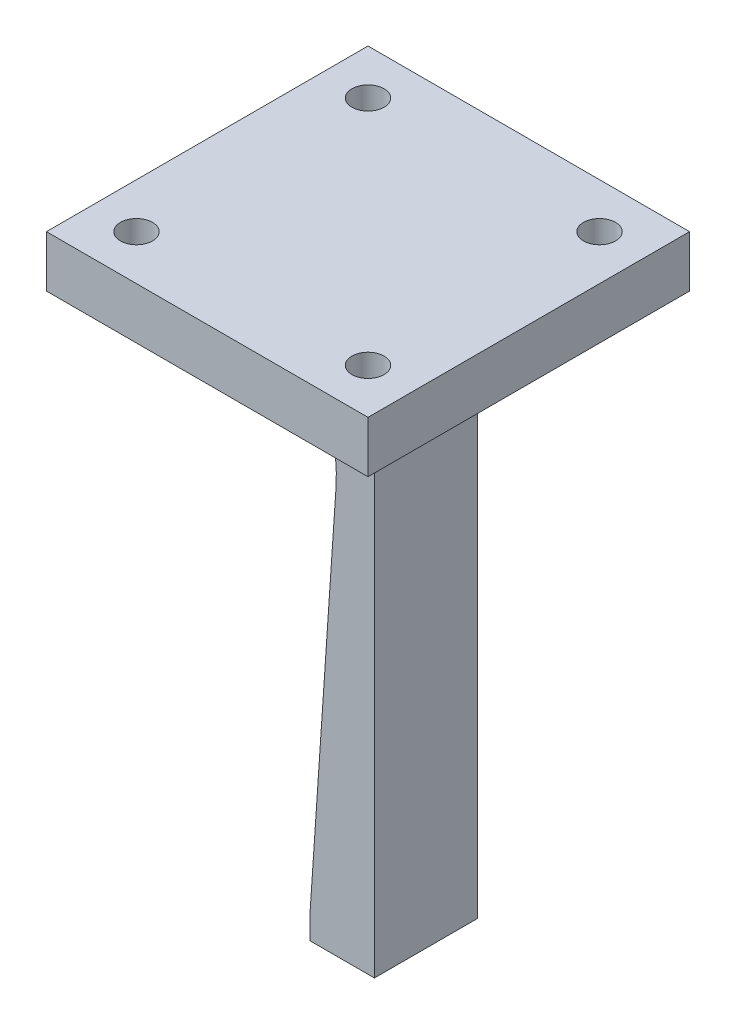
ISO-10303-21;
HEADER;
FILE_DESCRIPTION(('STEP AP214'),'2;1');
FILE_NAME('part.step','',(''),(''),'','','');
FILE_SCHEMA(('AUTOMOTIVE_DESIGN { 1 0 10303 214 1 1 1 1 }'));
ENDSEC;
DATA;
#1=APPLICATION_CONTEXT('core data for automotive mechanical design processes');
#2=APPLICATION_PROTOCOL_DEFINITION('international standard','automotive_design',2000,#1);
#3=PRODUCT_CONTEXT('',#1,'mechanical');
#4=PRODUCT('Part','Part','',(#3));
#5=PRODUCT_RELATED_PRODUCT_CATEGORY('part','',(#4));
#6=PRODUCT_DEFINITION_FORMATION('','',#4);
#7=PRODUCT_DEFINITION_CONTEXT('part definition',#1,'design');
#8=PRODUCT_DEFINITION('design','',#6,#7);
#9=PRODUCT_DEFINITION_SHAPE('','',#8);
#10=(LENGTH_UNIT() NAMED_UNIT(*) SI_UNIT(.MILLI.,.METRE.));
#11=(NAMED_UNIT(*) PLANE_ANGLE_UNIT() SI_UNIT($,.RADIAN.));
#12=(NAMED_UNIT(*) SI_UNIT($,.STERADIAN.) SOLID_ANGLE_UNIT());
#13=UNCERTAINTY_MEASURE_WITH_UNIT(LENGTH_MEASURE(1.E-05),#10,'distance_accuracy_value','');
#14=(GEOMETRIC_REPRESENTATION_CONTEXT(3) GLOBAL_UNCERTAINTY_ASSIGNED_CONTEXT((#13)) GLOBAL_UNIT_ASSIGNED_CONTEXT((#10,
#11,#12)) REPRESENTATION_CONTEXT('',''));
#15=CARTESIAN_POINT('',(0.,0.,0.));
#16=DIRECTION('',(0.,0.,1.));
#17=DIRECTION('',(1.,0.,0.));
#18=AXIS2_PLACEMENT_3D('',#15,#16,#17);
#19=CARTESIAN_POINT('',(0.,4.,0.));
#20=DIRECTION('',(1.,0.,0.));
#21=DIRECTION('',(0.,0.,-1.));
#22=AXIS2_PLACEMENT_3D('',#19,#20,#21);
#23=PLANE('',#22);
#24=DIRECTION('',(0.,-1.,0.));
#25=VECTOR('',#24,1.);
#26=CARTESIAN_POINT('',(0.,4.,-13.));
#27=LINE('',#26,#25);
#28=CARTESIAN_POINT('',(0.,2.,-13.));
#29=VERTEX_POINT('',#28);
#30=CARTESIAN_POINT('',(0.,0.,-13.));
#31=VERTEX_POINT('',#30);
#32=EDGE_CURVE('E165',#29,#31,#27,.T.);
#33=ORIENTED_EDGE('',*,*,#32,.F.);
#34=DIRECTION('',(0.,0.,1.));
#35=VECTOR('',#34,1.);
#36=CARTESIAN_POINT('',(0.,2.,-13.));
#37=LINE('',#36,#35);
#38=CARTESIAN_POINT('',(0.,2.,-10.5));
#39=VERTEX_POINT('',#38);
#40=EDGE_CURVE('E163',#29,#39,#37,.T.);
#41=ORIENTED_EDGE('',*,*,#40,.T.);
#42=DIRECTION('',(0.,0.,1.));
#43=VECTOR('',#42,1.);
#44=CARTESIAN_POINT('',(0.,2.,-10.5));
#45=LINE('',#44,#43);
#46=CARTESIAN_POINT('',(0.,2.,-2.5));
#47=VERTEX_POINT('',#46);
#48=EDGE_CURVE('E150',#39,#47,#45,.T.);
#49=ORIENTED_EDGE('',*,*,#48,.T.);
#50=CARTESIAN_POINT('',(0.,2.,0.));
#51=VERTEX_POINT('',#50);
#52=EDGE_CURVE('E167',#47,#51,#37,.T.);
#53=ORIENTED_EDGE('',*,*,#52,.T.);
#54=DIRECTION('',(0.,-1.,0.));
#55=VECTOR('',#54,1.);
#56=CARTESIAN_POINT('',(0.,4.,0.));
#57=LINE('',#56,#55);
#58=CARTESIAN_POINT('',(0.,0.,0.));
#59=VERTEX_POINT('',#58);
#60=EDGE_CURVE('E229',#51,#59,#57,.T.);
#61=ORIENTED_EDGE('',*,*,#60,.T.);
#62=DIRECTION('',(0.,0.,1.));
#63=VECTOR('',#62,1.);
#64=CARTESIAN_POINT('',(0.,0.,0.));
#65=LINE('',#64,#63);
#66=EDGE_CURVE('E206',#31,#59,#65,.T.);
#67=ORIENTED_EDGE('',*,*,#66,.F.);
#68=EDGE_LOOP('',(#33,#41,#49,#53,#61,#67));
#69=FACE_BOUND('',#68,.T.);
#70=ADVANCED_FACE('F36',(#69),#23,.T.);
#71=CARTESIAN_POINT('',(0.,4.,0.));
#72=DIRECTION('',(0.,0.,-1.));
#73=DIRECTION('',(-1.,0.,0.));
#74=AXIS2_PLACEMENT_3D('',#71,#72,#73);
#75=PLANE('',#74);
#76=ORIENTED_EDGE('',*,*,#60,.F.);
#77=DIRECTION('',(1.,0.,0.));
#78=VECTOR('',#77,1.);
#79=CARTESIAN_POINT('',(0.,2.,0.));
#80=LINE('',#79,#78);
#81=CARTESIAN_POINT('',(13.,2.,0.));
#82=VERTEX_POINT('',#81);
#83=EDGE_CURVE('E176',#51,#82,#80,.T.);
#84=ORIENTED_EDGE('',*,*,#83,.T.);
#85=DIRECTION('',(0.,-1.,0.));
#86=VECTOR('',#85,1.);
#87=CARTESIAN_POINT('',(13.,4.,0.));
#88=LINE('',#87,#86);
#89=CARTESIAN_POINT('',(13.,0.,0.));
#90=VERTEX_POINT('',#89);
#91=EDGE_CURVE('E227',#82,#90,#88,.T.);
#92=ORIENTED_EDGE('',*,*,#91,.T.);
#93=DIRECTION('',(1.,0.,0.));
#94=VECTOR('',#93,1.);
#95=CARTESIAN_POINT('',(0.,0.,0.));
#96=LINE('',#95,#94);
#97=EDGE_CURVE('E215',#59,#90,#96,.T.);
#98=ORIENTED_EDGE('',*,*,#97,.F.);
#99=EDGE_LOOP('',(#76,#84,#92,#98));
#100=FACE_BOUND('',#99,.T.);
#101=ADVANCED_FACE('F318',(#100),#75,.T.);
#102=CARTESIAN_POINT('',(13.,4.,0.));
#103=DIRECTION('',(-1.,0.,0.));
#104=DIRECTION('',(0.,0.,1.));
#105=AXIS2_PLACEMENT_3D('',#102,#103,#104);
#106=PLANE('',#105);
#107=ORIENTED_EDGE('',*,*,#91,.F.);
#108=DIRECTION('',(0.,0.,-1.));
#109=VECTOR('',#108,1.);
#110=CARTESIAN_POINT('',(13.,2.,-2.5));
#111=LINE('',#110,#109);
#112=CARTESIAN_POINT('',(13.,2.,-13.));
#113=VERTEX_POINT('',#112);
#114=EDGE_CURVE('E61',#82,#113,#111,.T.);
#115=ORIENTED_EDGE('',*,*,#114,.T.);
#116=DIRECTION('',(0.,-1.,0.));
#117=VECTOR('',#116,1.);
#118=CARTESIAN_POINT('',(13.,4.,-13.));
#119=LINE('',#118,#117);
#120=CARTESIAN_POINT('',(13.,0.,-13.));
#121=VERTEX_POINT('',#120);
#122=EDGE_CURVE('E225',#113,#121,#119,.T.);
#123=ORIENTED_EDGE('',*,*,#122,.T.);
#124=DIRECTION('',(0.,0.,-1.));
#125=VECTOR('',#124,1.);
#126=CARTESIAN_POINT('',(13.,0.,0.));
#127=LINE('',#126,#125);
#128=EDGE_CURVE('E218',#90,#121,#127,.T.);
#129=ORIENTED_EDGE('',*,*,#128,.F.);
#130=EDGE_LOOP('',(#107,#115,#123,#129));
#131=FACE_BOUND('',#130,.T.);
#132=ADVANCED_FACE('F320',(#131),#106,.T.);
#133=CARTESIAN_POINT('',(0.,4.,-13.));
#134=DIRECTION('',(0.,0.,1.));
#135=DIRECTION('',(1.,0.,0.));
#136=AXIS2_PLACEMENT_3D('',#133,#134,#135);
#137=PLANE('',#136);
#138=ORIENTED_EDGE('',*,*,#122,.F.);
#139=DIRECTION('',(-1.,0.,0.));
#140=VECTOR('',#139,1.);
#141=CARTESIAN_POINT('',(0.,2.,-13.));
#142=LINE('',#141,#140);
#143=EDGE_CURVE('E53',#113,#29,#142,.T.);
#144=ORIENTED_EDGE('',*,*,#143,.T.);
#145=ORIENTED_EDGE('',*,*,#32,.T.);
#146=DIRECTION('',(-1.,0.,0.));
#147=VECTOR('',#146,1.);
#148=CARTESIAN_POINT('',(0.,0.,-13.));
#149=LINE('',#148,#147);
#150=EDGE_CURVE('E221',#121,#31,#149,.T.);
#151=ORIENTED_EDGE('',*,*,#150,.F.);
#152=EDGE_LOOP('',(#138,#144,#145,#151));
#153=FACE_BOUND('',#152,.T.);
#154=ADVANCED_FACE('F321',(#153),#137,.T.);
#155=CARTESIAN_POINT('',(0.,0.,-2.5));
#156=DIRECTION('',(0.,0.,1.));
#157=DIRECTION('',(1.,0.,0.));
#158=AXIS2_PLACEMENT_3D('',#155,#156,#157);
#159=PLANE('',#158);
#160=DIRECTION('',(0.,-1.,0.));
#161=VECTOR('',#160,1.);
#162=CARTESIAN_POINT('',(11.,-42.,-2.5));
#163=LINE('',#162,#161);
#164=CARTESIAN_POINT('',(11.,2.,-2.5));
#165=VERTEX_POINT('',#164);
#166=CARTESIAN_POINT('',(11.,-42.,-2.5));
#167=VERTEX_POINT('',#166);
#168=EDGE_CURVE('E194',#165,#167,#163,.T.);
#169=ORIENTED_EDGE('',*,*,#168,.F.);
#170=DIRECTION('',(-1.,0.,0.));
#171=VECTOR('',#170,1.);
#172=CARTESIAN_POINT('',(0.,2.,-2.5));
#173=LINE('',#172,#171);
#174=EDGE_CURVE('E173',#165,#47,#173,.T.);
#175=ORIENTED_EDGE('',*,*,#174,.T.);
#176=CARTESIAN_POINT('',(-4.4615218751535,-9.67667857558505,-2.5));
#177=DIRECTION('',(0.,0.,-1.));
#178=DIRECTION('',(1.,0.,0.));
#179=AXIS2_PLACEMENT_3D('',#176,#177,#178);
#180=CIRCLE('',#179,12.5);
#181=CARTESIAN_POINT('',(8.00952428336575,-10.5269771773023,-2.5));
#182=VERTEX_POINT('',#181);
#183=EDGE_CURVE('E151',#47,#182,#180,.T.);
#184=ORIENTED_EDGE('',*,*,#183,.T.);
#185=DIRECTION('',(0.0680238881373777,0.99768369268154,0.));
#186=VECTOR('',#185,1.);
#187=CARTESIAN_POINT('',(6.,-40.,-2.5));
#188=LINE('',#187,#186);
#189=CARTESIAN_POINT('',(6.,-40.,-2.5));
#190=VERTEX_POINT('',#189);
#191=EDGE_CURVE('E185',#190,#182,#188,.T.);
#192=ORIENTED_EDGE('',*,*,#191,.F.);
#193=DIRECTION('',(0.,1.,0.));
#194=VECTOR('',#193,1.);
#195=CARTESIAN_POINT('',(6.,-40.,-2.5));
#196=LINE('',#195,#194);
#197=CARTESIAN_POINT('',(6.,-42.,-2.5));
#198=VERTEX_POINT('',#197);
#199=EDGE_CURVE('E200',#198,#190,#196,.T.);
#200=ORIENTED_EDGE('',*,*,#199,.F.);
#201=DIRECTION('',(-1.,0.,0.));
#202=VECTOR('',#201,1.);
#203=CARTESIAN_POINT('',(6.,-42.,-2.5));
#204=LINE('',#203,#202);
#205=EDGE_CURVE('E197',#167,#198,#204,.T.);
#206=ORIENTED_EDGE('',*,*,#205,.F.);
#207=EDGE_LOOP('',(#169,#175,#184,#192,#200,#206));
#208=FACE_BOUND('',#207,.T.);
#209=ADVANCED_FACE('F323',(#208),#159,.T.);
#210=CARTESIAN_POINT('',(0.,0.,-10.5));
#211=DIRECTION('',(0.,0.,1.));
#212=DIRECTION('',(1.,0.,0.));
#213=AXIS2_PLACEMENT_3D('',#210,#211,#212);
#214=PLANE('',#213);
#215=DIRECTION('',(-1.,0.,0.));
#216=VECTOR('',#215,1.);
#217=CARTESIAN_POINT('',(0.,2.,-10.5));
#218=LINE('',#217,#216);
#219=CARTESIAN_POINT('',(11.,2.,-10.5));
#220=VERTEX_POINT('',#219);
#221=EDGE_CURVE('E144',#220,#39,#218,.T.);
#222=ORIENTED_EDGE('',*,*,#221,.F.);
#223=DIRECTION('',(0.,-1.,0.));
#224=VECTOR('',#223,1.);
#225=CARTESIAN_POINT('',(11.,-42.,-10.5));
#226=LINE('',#225,#224);
#227=CARTESIAN_POINT('',(11.,-42.,-10.5));
#228=VERTEX_POINT('',#227);
#229=EDGE_CURVE('E187',#220,#228,#226,.T.);
#230=ORIENTED_EDGE('',*,*,#229,.T.);
#231=DIRECTION('',(-1.,0.,0.));
#232=VECTOR('',#231,1.);
#233=CARTESIAN_POINT('',(6.,-42.,-10.5));
#234=LINE('',#233,#232);
#235=CARTESIAN_POINT('',(6.,-42.,-10.5));
#236=VERTEX_POINT('',#235);
#237=EDGE_CURVE('E189',#228,#236,#234,.T.);
#238=ORIENTED_EDGE('',*,*,#237,.T.);
#239=DIRECTION('',(0.,1.,0.));
#240=VECTOR('',#239,1.);
#241=CARTESIAN_POINT('',(6.,-40.,-10.5));
#242=LINE('',#241,#240);
#243=CARTESIAN_POINT('',(6.,-40.,-10.5));
#244=VERTEX_POINT('',#243);
#245=EDGE_CURVE('E192',#236,#244,#242,.T.);
#246=ORIENTED_EDGE('',*,*,#245,.T.);
#247=DIRECTION('',(0.0680238881373777,0.99768369268154,0.));
#248=VECTOR('',#247,1.);
#249=CARTESIAN_POINT('',(6.,-40.,-10.5));
#250=LINE('',#249,#248);
#251=CARTESIAN_POINT('',(8.00952428336575,-10.5269771773023,-10.5));
#252=VERTEX_POINT('',#251);
#253=EDGE_CURVE('E147',#244,#252,#250,.T.);
#254=ORIENTED_EDGE('',*,*,#253,.T.);
#255=CARTESIAN_POINT('',(-4.4615218751535,-9.67667857558505,-10.5));
#256=DIRECTION('',(0.,0.,-1.));
#257=DIRECTION('',(1.,0.,0.));
#258=AXIS2_PLACEMENT_3D('',#255,#256,#257);
#259=CIRCLE('',#258,12.5);
#260=EDGE_CURVE('E139',#39,#252,#259,.T.);
#261=ORIENTED_EDGE('',*,*,#260,.F.);
#262=EDGE_LOOP('',(#222,#230,#238,#246,#254,#261));
#263=FACE_BOUND('',#262,.T.);
#264=ADVANCED_FACE('F141',(#263),#214,.F.);
#265=CARTESIAN_POINT('',(6.00000000000001,-40.,41.6021541423999));
#266=DIRECTION('',(-0.99768369268154,0.0680238881373777,0.));
#267=DIRECTION('',(-0.0680238881373777,-0.99768369268154,0.));
#268=AXIS2_PLACEMENT_3D('',#265,#266,#267);
#269=PLANE('',#268);
#270=ORIENTED_EDGE('',*,*,#191,.T.);
#271=DIRECTION('',(0.,0.,1.));
#272=VECTOR('',#271,1.);
#273=CARTESIAN_POINT('',(8.00952428336576,-10.5269771773023,-10.5));
#274=LINE('',#273,#272);
#275=EDGE_CURVE('E160',#252,#182,#274,.T.);
#276=ORIENTED_EDGE('',*,*,#275,.F.);
#277=ORIENTED_EDGE('',*,*,#253,.F.);
#278=DIRECTION('',(0.,0.,-1.));
#279=VECTOR('',#278,1.);
#280=CARTESIAN_POINT('',(6.,-40.,-2.5));
#281=LINE('',#280,#279);
#282=EDGE_CURVE('E203',#190,#244,#281,.T.);
#283=ORIENTED_EDGE('',*,*,#282,.F.);
#284=EDGE_LOOP('',(#270,#276,#277,#283));
#285=FACE_BOUND('',#284,.T.);
#286=ADVANCED_FACE('F289',(#285),#269,.T.);
#287=CARTESIAN_POINT('',(0.,4.,0.));
#288=DIRECTION('',(0.,1.,0.));
#289=DIRECTION('',(0.,0.,1.));
#290=AXIS2_PLACEMENT_3D('',#287,#288,#289);
#291=PLANE('',#290);
#292=CARTESIAN_POINT('',(15.5,4.,2.49999999999999));
#293=DIRECTION('',(0.,1.,0.));
#294=DIRECTION('',(0.,0.,1.));
#295=AXIS2_PLACEMENT_3D('',#292,#293,#294);
#296=CIRCLE('',#295,1.25);
#297=CARTESIAN_POINT('',(15.5,4.,3.74999999999999));
#298=VERTEX_POINT('',#297);
#299=EDGE_CURVE('E276',#298,#298,#296,.T.);
#300=ORIENTED_EDGE('',*,*,#299,.F.);
#301=EDGE_LOOP('',(#300));
#302=FACE_BOUND('',#301,.T.);
#303=CARTESIAN_POINT('',(-2.5,4.,2.5));
#304=DIRECTION('',(0.,1.,0.));
#305=DIRECTION('',(0.,0.,1.));
#306=AXIS2_PLACEMENT_3D('',#303,#304,#305);
#307=CIRCLE('',#306,1.25);
#308=CARTESIAN_POINT('',(-2.5,4.,3.75));
#309=VERTEX_POINT('',#308);
#310=EDGE_CURVE('E266',#309,#309,#307,.T.);
#311=ORIENTED_EDGE('',*,*,#310,.F.);
#312=EDGE_LOOP('',(#311));
#313=FACE_BOUND('',#312,.T.);
#314=CARTESIAN_POINT('',(15.5,4.,-15.5));
#315=DIRECTION('',(0.,1.,0.));
#316=DIRECTION('',(0.,0.,1.));
#317=AXIS2_PLACEMENT_3D('',#314,#315,#316);
#318=CIRCLE('',#317,1.25);
#319=CARTESIAN_POINT('',(15.5,4.,-14.25));
#320=VERTEX_POINT('',#319);
#321=EDGE_CURVE('E263',#320,#320,#318,.T.);
#322=ORIENTED_EDGE('',*,*,#321,.F.);
#323=EDGE_LOOP('',(#322));
#324=FACE_BOUND('',#323,.T.);
#325=CARTESIAN_POINT('',(-2.5,4.,-15.5));
#326=DIRECTION('',(0.,1.,0.));
#327=DIRECTION('',(0.,0.,1.));
#328=AXIS2_PLACEMENT_3D('',#325,#326,#327);
#329=CIRCLE('',#328,1.25);
#330=CARTESIAN_POINT('',(-2.5,4.,-14.25));
#331=VERTEX_POINT('',#330);
#332=EDGE_CURVE('E260',#331,#331,#329,.T.);
#333=ORIENTED_EDGE('',*,*,#332,.F.);
#334=EDGE_LOOP('',(#333));
#335=FACE_BOUND('',#334,.T.);
#336=DIRECTION('',(0.,0.,1.));
#337=VECTOR('',#336,1.);
#338=CARTESIAN_POINT('',(-6.00000000000001,4.,-19.));
#339=LINE('',#338,#337);
#340=CARTESIAN_POINT('',(-6.00000000000001,4.,-19.));
#341=VERTEX_POINT('',#340);
#342=CARTESIAN_POINT('',(-6.,4.,6.00000000000001));
#343=VERTEX_POINT('',#342);
#344=EDGE_CURVE('E232',#341,#343,#339,.T.);
#345=ORIENTED_EDGE('',*,*,#344,.T.);
#346=DIRECTION('',(1.,0.,0.));
#347=VECTOR('',#346,1.);
#348=CARTESIAN_POINT('',(-6.,4.,6.00000000000001));
#349=LINE('',#348,#347);
#350=CARTESIAN_POINT('',(19.,4.,6.));
#351=VERTEX_POINT('',#350);
#352=EDGE_CURVE('E235',#343,#351,#349,.T.);
#353=ORIENTED_EDGE('',*,*,#352,.T.);
#354=DIRECTION('',(0.,0.,-1.));
#355=VECTOR('',#354,1.);
#356=CARTESIAN_POINT('',(19.,4.,-19.));
#357=LINE('',#356,#355);
#358=CARTESIAN_POINT('',(19.,4.,-19.));
#359=VERTEX_POINT('',#358);
#360=EDGE_CURVE('E238',#351,#359,#357,.T.);
#361=ORIENTED_EDGE('',*,*,#360,.T.);
#362=DIRECTION('',(-1.,0.,0.));
#363=VECTOR('',#362,1.);
#364=CARTESIAN_POINT('',(-6.00000000000001,4.,-19.));
#365=LINE('',#364,#363);
#366=EDGE_CURVE('E240',#359,#341,#365,.T.);
#367=ORIENTED_EDGE('',*,*,#366,.T.);
#368=EDGE_LOOP('',(#345,#353,#361,#367));
#369=FACE_BOUND('',#368,.T.);
#370=ADVANCED_FACE('F285',(#302,#313,#324,#335,#369),#291,.T.);
#371=CARTESIAN_POINT('',(0.,0.,0.));
#372=DIRECTION('',(0.,1.,0.));
#373=DIRECTION('',(0.,0.,1.));
#374=AXIS2_PLACEMENT_3D('',#371,#372,#373);
#375=PLANE('',#374);
#376=CARTESIAN_POINT('',(15.5,0.,2.49999999999999));
#377=DIRECTION('',(0.,1.,0.));
#378=DIRECTION('',(0.,0.,1.));
#379=AXIS2_PLACEMENT_3D('',#376,#377,#378);
#380=CIRCLE('',#379,1.25);
#381=CARTESIAN_POINT('',(15.5,0.,3.74999999999999));
#382=VERTEX_POINT('',#381);
#383=EDGE_CURVE('E40',#382,#382,#380,.T.);
#384=ORIENTED_EDGE('',*,*,#383,.T.);
#385=EDGE_LOOP('',(#384));
#386=FACE_BOUND('',#385,.T.);
#387=CARTESIAN_POINT('',(-2.5,0.,2.5));
#388=DIRECTION('',(0.,1.,0.));
#389=DIRECTION('',(0.,0.,1.));
#390=AXIS2_PLACEMENT_3D('',#387,#388,#389);
#391=CIRCLE('',#390,1.25);
#392=CARTESIAN_POINT('',(-2.5,0.,3.75));
#393=VERTEX_POINT('',#392);
#394=EDGE_CURVE('E264',#393,#393,#391,.T.);
#395=ORIENTED_EDGE('',*,*,#394,.T.);
#396=EDGE_LOOP('',(#395));
#397=FACE_BOUND('',#396,.T.);
#398=CARTESIAN_POINT('',(15.5,0.,-15.5));
#399=DIRECTION('',(0.,1.,0.));
#400=DIRECTION('',(0.,0.,1.));
#401=AXIS2_PLACEMENT_3D('',#398,#399,#400);
#402=CIRCLE('',#401,1.25);
#403=CARTESIAN_POINT('',(15.5,0.,-14.25));
#404=VERTEX_POINT('',#403);
#405=EDGE_CURVE('E261',#404,#404,#402,.T.);
#406=ORIENTED_EDGE('',*,*,#405,.T.);
#407=EDGE_LOOP('',(#406));
#408=FACE_BOUND('',#407,.T.);
#409=CARTESIAN_POINT('',(-2.5,0.,-15.5));
#410=DIRECTION('',(0.,1.,0.));
#411=DIRECTION('',(0.,0.,1.));
#412=AXIS2_PLACEMENT_3D('',#409,#410,#411);
#413=CIRCLE('',#412,1.25);
#414=CARTESIAN_POINT('',(-2.5,0.,-14.25));
#415=VERTEX_POINT('',#414);
#416=EDGE_CURVE('E257',#415,#415,#413,.T.);
#417=ORIENTED_EDGE('',*,*,#416,.T.);
#418=EDGE_LOOP('',(#417));
#419=FACE_BOUND('',#418,.T.);
#420=DIRECTION('',(0.,0.,1.));
#421=VECTOR('',#420,1.);
#422=CARTESIAN_POINT('',(-6.00000000000001,0.,-19.));
#423=LINE('',#422,#421);
#424=CARTESIAN_POINT('',(-6.00000000000001,0.,-19.));
#425=VERTEX_POINT('',#424);
#426=CARTESIAN_POINT('',(-6.,0.,6.00000000000001));
#427=VERTEX_POINT('',#426);
#428=EDGE_CURVE('E231',#425,#427,#423,.T.);
#429=ORIENTED_EDGE('',*,*,#428,.F.);
#430=DIRECTION('',(-1.,0.,0.));
#431=VECTOR('',#430,1.);
#432=CARTESIAN_POINT('',(-6.00000000000001,0.,-19.));
#433=LINE('',#432,#431);
#434=CARTESIAN_POINT('',(19.,0.,-19.));
#435=VERTEX_POINT('',#434);
#436=EDGE_CURVE('E236',#435,#425,#433,.T.);
#437=ORIENTED_EDGE('',*,*,#436,.F.);
#438=DIRECTION('',(0.,0.,-1.));
#439=VECTOR('',#438,1.);
#440=CARTESIAN_POINT('',(19.,0.,-19.));
#441=LINE('',#440,#439);
#442=CARTESIAN_POINT('',(19.,0.,6.));
#443=VERTEX_POINT('',#442);
#444=EDGE_CURVE('E247',#443,#435,#441,.T.);
#445=ORIENTED_EDGE('',*,*,#444,.F.);
#446=DIRECTION('',(1.,0.,0.));
#447=VECTOR('',#446,1.);
#448=CARTESIAN_POINT('',(-6.,0.,6.00000000000001));
#449=LINE('',#448,#447);
#450=EDGE_CURVE('E245',#427,#443,#449,.T.);
#451=ORIENTED_EDGE('',*,*,#450,.F.);
#452=EDGE_LOOP('',(#429,#437,#445,#451));
#453=FACE_BOUND('',#452,.T.);
#454=ORIENTED_EDGE('',*,*,#66,.T.);
#455=ORIENTED_EDGE('',*,*,#97,.T.);
#456=ORIENTED_EDGE('',*,*,#128,.T.);
#457=ORIENTED_EDGE('',*,*,#150,.T.);
#458=EDGE_LOOP('',(#454,#455,#456,#457));
#459=FACE_BOUND('',#458,.T.);
#460=ADVANCED_FACE('F288',(#386,#397,#408,#419,#453,#459),#375,.F.);
#461=CARTESIAN_POINT('',(-6.00000000000001,4.,-19.));
#462=DIRECTION('',(1.,0.,0.));
#463=DIRECTION('',(0.,0.,-1.));
#464=AXIS2_PLACEMENT_3D('',#461,#462,#463);
#465=PLANE('',#464);
#466=ORIENTED_EDGE('',*,*,#428,.T.);
#467=DIRECTION('',(0.,-1.,0.));
#468=VECTOR('',#467,1.);
#469=CARTESIAN_POINT('',(-6.,4.,6.00000000000001));
#470=LINE('',#469,#468);
#471=EDGE_CURVE('E11',#343,#427,#470,.T.);
#472=ORIENTED_EDGE('',*,*,#471,.F.);
#473=ORIENTED_EDGE('',*,*,#344,.F.);
#474=DIRECTION('',(0.,-1.,0.));
#475=VECTOR('',#474,1.);
#476=CARTESIAN_POINT('',(-6.00000000000001,4.,-19.));
#477=LINE('',#476,#475);
#478=EDGE_CURVE('E242',#341,#425,#477,.T.);
#479=ORIENTED_EDGE('',*,*,#478,.T.);
#480=EDGE_LOOP('',(#466,#472,#473,#479));
#481=FACE_BOUND('',#480,.T.);
#482=ADVANCED_FACE('F38',(#481),#465,.F.);
#483=CARTESIAN_POINT('',(-6.,4.,6.00000000000001));
#484=DIRECTION('',(0.,0.,-1.));
#485=DIRECTION('',(-1.,0.,0.));
#486=AXIS2_PLACEMENT_3D('',#483,#484,#485);
#487=PLANE('',#486);
#488=ORIENTED_EDGE('',*,*,#450,.T.);
#489=DIRECTION('',(0.,-1.,0.));
#490=VECTOR('',#489,1.);
#491=CARTESIAN_POINT('',(19.,4.,6.));
#492=LINE('',#491,#490);
#493=EDGE_CURVE('E45',#351,#443,#492,.T.);
#494=ORIENTED_EDGE('',*,*,#493,.F.);
#495=ORIENTED_EDGE('',*,*,#352,.F.);
#496=ORIENTED_EDGE('',*,*,#471,.T.);
#497=EDGE_LOOP('',(#488,#494,#495,#496));
#498=FACE_BOUND('',#497,.T.);
#499=ADVANCED_FACE('F300',(#498),#487,.F.);
#500=CARTESIAN_POINT('',(19.,4.,-19.));
#501=DIRECTION('',(-1.,0.,0.));
#502=DIRECTION('',(0.,0.,1.));
#503=AXIS2_PLACEMENT_3D('',#500,#501,#502);
#504=PLANE('',#503);
#505=ORIENTED_EDGE('',*,*,#444,.T.);
#506=DIRECTION('',(0.,-1.,0.));
#507=VECTOR('',#506,1.);
#508=CARTESIAN_POINT('',(19.,4.,-19.));
#509=LINE('',#508,#507);
#510=EDGE_CURVE('E252',#359,#435,#509,.T.);
#511=ORIENTED_EDGE('',*,*,#510,.F.);
#512=ORIENTED_EDGE('',*,*,#360,.F.);
#513=ORIENTED_EDGE('',*,*,#493,.T.);
#514=EDGE_LOOP('',(#505,#511,#512,#513));
#515=FACE_BOUND('',#514,.T.);
#516=ADVANCED_FACE('F305',(#515),#504,.F.);
#517=CARTESIAN_POINT('',(-6.00000000000001,4.,-19.));
#518=DIRECTION('',(0.,0.,1.));
#519=DIRECTION('',(1.,0.,0.));
#520=AXIS2_PLACEMENT_3D('',#517,#518,#519);
#521=PLANE('',#520);
#522=ORIENTED_EDGE('',*,*,#436,.T.);
#523=ORIENTED_EDGE('',*,*,#478,.F.);
#524=ORIENTED_EDGE('',*,*,#366,.F.);
#525=ORIENTED_EDGE('',*,*,#510,.T.);
#526=EDGE_LOOP('',(#522,#523,#524,#525));
#527=FACE_BOUND('',#526,.T.);
#528=ADVANCED_FACE('F308',(#527),#521,.F.);
#529=CARTESIAN_POINT('',(6.,-40.,-2.5));
#530=DIRECTION('',(-1.,0.,0.));
#531=DIRECTION('',(0.,0.,1.));
#532=AXIS2_PLACEMENT_3D('',#529,#530,#531);
#533=PLANE('',#532);
#534=ORIENTED_EDGE('',*,*,#282,.T.);
#535=ORIENTED_EDGE('',*,*,#245,.F.);
#536=DIRECTION('',(0.,0.,-1.));
#537=VECTOR('',#536,1.);
#538=CARTESIAN_POINT('',(6.,-42.,-2.5));
#539=LINE('',#538,#537);
#540=EDGE_CURVE('E207',#198,#236,#539,.T.);
#541=ORIENTED_EDGE('',*,*,#540,.F.);
#542=ORIENTED_EDGE('',*,*,#199,.T.);
#543=EDGE_LOOP('',(#534,#535,#541,#542));
#544=FACE_BOUND('',#543,.T.);
#545=ADVANCED_FACE('F343',(#544),#533,.T.);
#546=CARTESIAN_POINT('',(6.,-42.,-2.5));
#547=DIRECTION('',(0.,-1.,0.));
#548=DIRECTION('',(0.,0.,-1.));
#549=AXIS2_PLACEMENT_3D('',#546,#547,#548);
#550=PLANE('',#549);
#551=ORIENTED_EDGE('',*,*,#540,.T.);
#552=ORIENTED_EDGE('',*,*,#237,.F.);
#553=DIRECTION('',(0.,0.,-1.));
#554=VECTOR('',#553,1.);
#555=CARTESIAN_POINT('',(11.,-42.,-2.5));
#556=LINE('',#555,#554);
#557=EDGE_CURVE('E209',#167,#228,#556,.T.);
#558=ORIENTED_EDGE('',*,*,#557,.F.);
#559=ORIENTED_EDGE('',*,*,#205,.T.);
#560=EDGE_LOOP('',(#551,#552,#558,#559));
#561=FACE_BOUND('',#560,.T.);
#562=ADVANCED_FACE('F412',(#561),#550,.T.);
#563=CARTESIAN_POINT('',(11.,-42.,-2.5));
#564=DIRECTION('',(1.,0.,0.));
#565=DIRECTION('',(0.,0.,-1.));
#566=AXIS2_PLACEMENT_3D('',#563,#564,#565);
#567=PLANE('',#566);
#568=ORIENTED_EDGE('',*,*,#557,.T.);
#569=ORIENTED_EDGE('',*,*,#229,.F.);
#570=DIRECTION('',(0.,0.,-1.));
#571=VECTOR('',#570,1.);
#572=CARTESIAN_POINT('',(11.,2.,-2.5));
#573=LINE('',#572,#571);
#574=EDGE_CURVE('E171',#165,#220,#573,.T.);
#575=ORIENTED_EDGE('',*,*,#574,.F.);
#576=ORIENTED_EDGE('',*,*,#168,.T.);
#577=EDGE_LOOP('',(#568,#569,#575,#576));
#578=FACE_BOUND('',#577,.T.);
#579=ADVANCED_FACE('F416',(#578),#567,.T.);
#580=CARTESIAN_POINT('',(11.,2.,-2.5));
#581=DIRECTION('',(0.,-1.,0.));
#582=DIRECTION('',(0.,0.,-1.));
#583=AXIS2_PLACEMENT_3D('',#580,#581,#582);
#584=PLANE('',#583);
#585=ORIENTED_EDGE('',*,*,#574,.T.);
#586=ORIENTED_EDGE('',*,*,#221,.T.);
#587=ORIENTED_EDGE('',*,*,#40,.F.);
#588=ORIENTED_EDGE('',*,*,#143,.F.);
#589=ORIENTED_EDGE('',*,*,#114,.F.);
#590=ORIENTED_EDGE('',*,*,#83,.F.);
#591=ORIENTED_EDGE('',*,*,#52,.F.);
#592=ORIENTED_EDGE('',*,*,#174,.F.);
#593=EDGE_LOOP('',(#585,#586,#587,#588,#589,#590,#591,#592));
#594=FACE_BOUND('',#593,.T.);
#595=ADVANCED_FACE('F169',(#594),#584,.T.);
#596=CARTESIAN_POINT('',(-4.4615218751535,-9.67667857558505,-10.5));
#597=DIRECTION('',(0.,0.,1.));
#598=DIRECTION('',(1.,0.,0.));
#599=AXIS2_PLACEMENT_3D('',#596,#597,#598);
#600=CYLINDRICAL_SURFACE('',#599,12.5);
#601=ORIENTED_EDGE('',*,*,#183,.F.);
#602=ORIENTED_EDGE('',*,*,#48,.F.);
#603=ORIENTED_EDGE('',*,*,#260,.T.);
#604=ORIENTED_EDGE('',*,*,#275,.T.);
#605=EDGE_LOOP('',(#601,#602,#603,#604));
#606=FACE_BOUND('',#605,.T.);
#607=ADVANCED_FACE('F156',(#606),#600,.F.);
#608=CARTESIAN_POINT('',(-2.5,-42.,-15.5));
#609=DIRECTION('',(0.,1.,0.));
#610=DIRECTION('',(0.,0.,1.));
#611=AXIS2_PLACEMENT_3D('',#608,#609,#610);
#612=CYLINDRICAL_SURFACE('',#611,1.25);
#613=ORIENTED_EDGE('',*,*,#332,.T.);
#614=EDGE_LOOP('',(#613));
#615=FACE_BOUND('',#614,.T.);
#616=ORIENTED_EDGE('',*,*,#416,.F.);
#617=EDGE_LOOP('',(#616));
#618=FACE_BOUND('',#617,.T.);
#619=ADVANCED_FACE('F282',(#615,#618),#612,.F.);
#620=CARTESIAN_POINT('',(15.5,-42.,-15.5));
#621=DIRECTION('',(0.,1.,0.));
#622=DIRECTION('',(0.,0.,1.));
#623=AXIS2_PLACEMENT_3D('',#620,#621,#622);
#624=CYLINDRICAL_SURFACE('',#623,1.25);
#625=ORIENTED_EDGE('',*,*,#321,.T.);
#626=EDGE_LOOP('',(#625));
#627=FACE_BOUND('',#626,.T.);
#628=ORIENTED_EDGE('',*,*,#405,.F.);
#629=EDGE_LOOP('',(#628));
#630=FACE_BOUND('',#629,.T.);
#631=ADVANCED_FACE('F368',(#627,#630),#624,.F.);
#632=CARTESIAN_POINT('',(-2.5,-42.,2.5));
#633=DIRECTION('',(0.,1.,0.));
#634=DIRECTION('',(0.,0.,1.));
#635=AXIS2_PLACEMENT_3D('',#632,#633,#634);
#636=CYLINDRICAL_SURFACE('',#635,1.25);
#637=ORIENTED_EDGE('',*,*,#310,.T.);
#638=EDGE_LOOP('',(#637));
#639=FACE_BOUND('',#638,.T.);
#640=ORIENTED_EDGE('',*,*,#394,.F.);
#641=EDGE_LOOP('',(#640));
#642=FACE_BOUND('',#641,.T.);
#643=ADVANCED_FACE('F379',(#639,#642),#636,.F.);
#644=CARTESIAN_POINT('',(15.5,-42.,2.49999999999999));
#645=DIRECTION('',(0.,1.,0.));
#646=DIRECTION('',(0.,0.,1.));
#647=AXIS2_PLACEMENT_3D('',#644,#645,#646);
#648=CYLINDRICAL_SURFACE('',#647,1.25);
#649=ORIENTED_EDGE('',*,*,#299,.T.);
#650=EDGE_LOOP('',(#649));
#651=FACE_BOUND('',#650,.T.);
#652=ORIENTED_EDGE('',*,*,#383,.F.);
#653=EDGE_LOOP('',(#652));
#654=FACE_BOUND('',#653,.T.);
#655=ADVANCED_FACE('F389',(#651,#654),#648,.F.);
#656=CLOSED_SHELL('',(#70,#101,#132,#154,#209,#264,#286,#370,#460,#482,#499,#516,#528,#545,#562,
#579,#595,#607,#619,#631,#643,#655));
#657=MANIFOLD_SOLID_BREP('B2',#656);
#658=ADVANCED_BREP_SHAPE_REPRESENTATION('',(#18,#657),#14);
#659=SHAPE_DEFINITION_REPRESENTATION(#9,#658);
ENDSEC;
END-ISO-10303-21;
